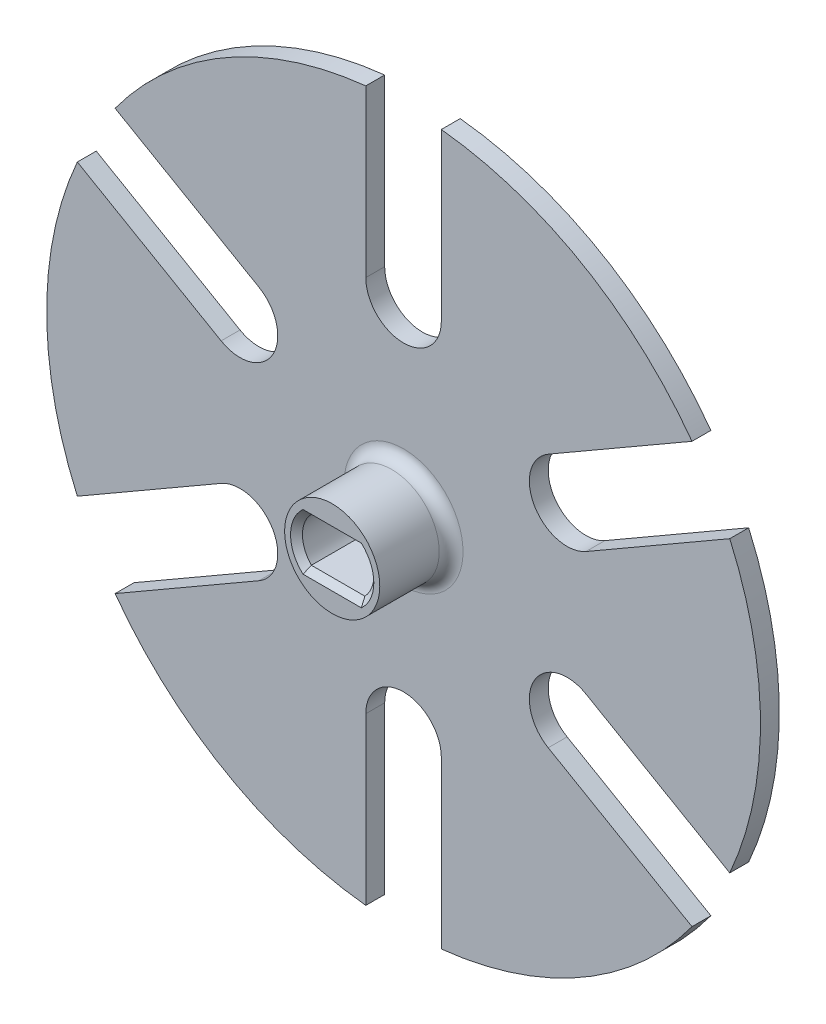
ISO-10303-21;
HEADER;
FILE_DESCRIPTION(('STEP AP214'),'2;1');
FILE_NAME('part.step','',(''),(''),'','','');
FILE_SCHEMA(('AUTOMOTIVE_DESIGN { 1 0 10303 214 1 1 1 1 }'));
ENDSEC;
DATA;
#1=APPLICATION_CONTEXT('core data for automotive mechanical design processes');
#2=APPLICATION_PROTOCOL_DEFINITION('international standard','automotive_design',2000,#1);
#3=PRODUCT_CONTEXT('',#1,'mechanical');
#4=PRODUCT('Part','Part','',(#3));
#5=PRODUCT_RELATED_PRODUCT_CATEGORY('part','',(#4));
#6=PRODUCT_DEFINITION_FORMATION('','',#4);
#7=PRODUCT_DEFINITION_CONTEXT('part definition',#1,'design');
#8=PRODUCT_DEFINITION('design','',#6,#7);
#9=PRODUCT_DEFINITION_SHAPE('','',#8);
#10=(LENGTH_UNIT() NAMED_UNIT(*) SI_UNIT(.MILLI.,.METRE.));
#11=(NAMED_UNIT(*) PLANE_ANGLE_UNIT() SI_UNIT($,.RADIAN.));
#12=(NAMED_UNIT(*) SI_UNIT($,.STERADIAN.) SOLID_ANGLE_UNIT());
#13=UNCERTAINTY_MEASURE_WITH_UNIT(LENGTH_MEASURE(1.E-05),#10,'distance_accuracy_value','');
#14=(GEOMETRIC_REPRESENTATION_CONTEXT(3) GLOBAL_UNCERTAINTY_ASSIGNED_CONTEXT((#13)) GLOBAL_UNIT_ASSIGNED_CONTEXT((#10,
#11,#12)) REPRESENTATION_CONTEXT('',''));
#15=CARTESIAN_POINT('',(0.,0.,0.));
#16=DIRECTION('',(0.,0.,1.));
#17=DIRECTION('',(1.,0.,0.));
#18=AXIS2_PLACEMENT_3D('',#15,#16,#17);
#19=CARTESIAN_POINT('',(0.,0.,-1.5875));
#20=DIRECTION('',(0.,0.,1.));
#21=DIRECTION('',(1.,0.,0.));
#22=AXIS2_PLACEMENT_3D('',#19,#20,#21);
#23=CYLINDRICAL_SURFACE('',#22,30.);
#24=CARTESIAN_POINT('',(0.,0.,-1.5875));
#25=DIRECTION('',(0.,0.,-1.));
#26=DIRECTION('',(-1.,0.,0.));
#27=AXIS2_PLACEMENT_3D('',#24,#25,#26);
#28=CIRCLE('',#27,30.);
#29=CARTESIAN_POINT('',(-24.2473510978869,17.6653888928549,-1.5875));
#30=VERTEX_POINT('',#29);
#31=CARTESIAN_POINT('',(-3.17500000000001,29.8315164716781,-1.5875));
#32=VERTEX_POINT('',#31);
#33=EDGE_CURVE('E464',#30,#32,#28,.T.);
#34=ORIENTED_EDGE('',*,*,#33,.F.);
#35=DIRECTION('',(0.,0.,1.));
#36=VECTOR('',#35,1.);
#37=CARTESIAN_POINT('',(-24.2473510978869,17.6653888928549,-1.5875));
#38=LINE('',#37,#36);
#39=CARTESIAN_POINT('',(-24.2473510978869,17.6653888928549,0.));
#40=VERTEX_POINT('',#39);
#41=EDGE_CURVE('E420',#30,#40,#38,.T.);
#42=ORIENTED_EDGE('',*,*,#41,.T.);
#43=CARTESIAN_POINT('',(0.,0.,0.));
#44=DIRECTION('',(0.,0.,-1.));
#45=DIRECTION('',(-1.,0.,0.));
#46=AXIS2_PLACEMENT_3D('',#43,#44,#45);
#47=CIRCLE('',#46,30.);
#48=CARTESIAN_POINT('',(-3.17500000000001,29.8315164716781,0.));
#49=VERTEX_POINT('',#48);
#50=EDGE_CURVE('E470',#40,#49,#47,.T.);
#51=ORIENTED_EDGE('',*,*,#50,.T.);
#52=DIRECTION('',(0.,0.,1.));
#53=VECTOR('',#52,1.);
#54=CARTESIAN_POINT('',(-3.17500000000001,29.8315164716781,-1.5875));
#55=LINE('',#54,#53);
#56=EDGE_CURVE('E447',#49,#32,#55,.F.);
#57=ORIENTED_EDGE('',*,*,#56,.T.);
#58=EDGE_LOOP('',(#34,#42,#51,#57));
#59=FACE_BOUND('',#58,.T.);
#60=ADVANCED_FACE('F47',(#59),#23,.T.);
#61=CARTESIAN_POINT('',(-27.4223510978872,-12.1661275788232,0.));
#62=VERTEX_POINT('',#61);
#63=CARTESIAN_POINT('',(-27.422351097887,12.1661275788238,0.));
#64=VERTEX_POINT('',#63);
#65=EDGE_CURVE('E610',#62,#64,#47,.T.);
#66=ORIENTED_EDGE('',*,*,#65,.T.);
#67=DIRECTION('',(0.,0.,1.));
#68=VECTOR('',#67,1.);
#69=CARTESIAN_POINT('',(-27.422351097887,12.1661275788238,-1.5875));
#70=LINE('',#69,#68);
#71=CARTESIAN_POINT('',(-27.422351097887,12.1661275788238,-1.5875));
#72=VERTEX_POINT('',#71);
#73=EDGE_CURVE('E65',#64,#72,#70,.F.);
#74=ORIENTED_EDGE('',*,*,#73,.T.);
#75=CARTESIAN_POINT('',(-27.4223510978872,-12.1661275788232,-1.5875));
#76=VERTEX_POINT('',#75);
#77=EDGE_CURVE('E634',#76,#72,#28,.T.);
#78=ORIENTED_EDGE('',*,*,#77,.F.);
#79=DIRECTION('',(0.,0.,1.));
#80=VECTOR('',#79,1.);
#81=CARTESIAN_POINT('',(-27.4223510978872,-12.1661275788232,-1.5875));
#82=LINE('',#81,#80);
#83=EDGE_CURVE('E414',#76,#62,#82,.T.);
#84=ORIENTED_EDGE('',*,*,#83,.T.);
#85=EDGE_LOOP('',(#66,#74,#78,#84));
#86=FACE_BOUND('',#85,.T.);
#87=ADVANCED_FACE('F669',(#86),#23,.T.);
#88=CARTESIAN_POINT('',(-3.17499999999999,-29.8315164716781,0.));
#89=VERTEX_POINT('',#88);
#90=CARTESIAN_POINT('',(-24.2473510978873,-17.6653888928544,0.));
#91=VERTEX_POINT('',#90);
#92=EDGE_CURVE('E602',#89,#91,#47,.T.);
#93=ORIENTED_EDGE('',*,*,#92,.T.);
#94=DIRECTION('',(0.,0.,1.));
#95=VECTOR('',#94,1.);
#96=CARTESIAN_POINT('',(-24.2473510978873,-17.6653888928544,-1.5875));
#97=LINE('',#96,#95);
#98=CARTESIAN_POINT('',(-24.2473510978873,-17.6653888928544,-1.5875));
#99=VERTEX_POINT('',#98);
#100=EDGE_CURVE('E72',#91,#99,#97,.F.);
#101=ORIENTED_EDGE('',*,*,#100,.T.);
#102=CARTESIAN_POINT('',(-3.17499999999999,-29.8315164716781,-1.5875));
#103=VERTEX_POINT('',#102);
#104=EDGE_CURVE('E637',#103,#99,#28,.T.);
#105=ORIENTED_EDGE('',*,*,#104,.F.);
#106=DIRECTION('',(0.,0.,1.));
#107=VECTOR('',#106,1.);
#108=CARTESIAN_POINT('',(-3.17499999999999,-29.8315164716781,-1.5875));
#109=LINE('',#108,#107);
#110=EDGE_CURVE('E408',#103,#89,#109,.T.);
#111=ORIENTED_EDGE('',*,*,#110,.T.);
#112=EDGE_LOOP('',(#93,#101,#105,#111));
#113=FACE_BOUND('',#112,.T.);
#114=ADVANCED_FACE('F605',(#113),#23,.T.);
#115=CARTESIAN_POINT('',(24.247351097887,-17.6653888928547,0.));
#116=VERTEX_POINT('',#115);
#117=CARTESIAN_POINT('',(3.17500000000001,-29.8315164716781,0.));
#118=VERTEX_POINT('',#117);
#119=EDGE_CURVE('E609',#116,#118,#47,.T.);
#120=ORIENTED_EDGE('',*,*,#119,.T.);
#121=DIRECTION('',(0.,0.,1.));
#122=VECTOR('',#121,1.);
#123=CARTESIAN_POINT('',(3.17500000000001,-29.8315164716781,-1.5875));
#124=LINE('',#123,#122);
#125=CARTESIAN_POINT('',(3.17500000000001,-29.8315164716781,-1.5875));
#126=VERTEX_POINT('',#125);
#127=EDGE_CURVE('E404',#118,#126,#124,.F.);
#128=ORIENTED_EDGE('',*,*,#127,.T.);
#129=CARTESIAN_POINT('',(24.247351097887,-17.6653888928547,-1.5875));
#130=VERTEX_POINT('',#129);
#131=EDGE_CURVE('E640',#130,#126,#28,.T.);
#132=ORIENTED_EDGE('',*,*,#131,.F.);
#133=DIRECTION('',(0.,0.,1.));
#134=VECTOR('',#133,1.);
#135=CARTESIAN_POINT('',(24.2473510978871,-17.6653888928547,-1.5875));
#136=LINE('',#135,#134);
#137=EDGE_CURVE('E400',#130,#116,#136,.T.);
#138=ORIENTED_EDGE('',*,*,#137,.T.);
#139=EDGE_LOOP('',(#120,#128,#132,#138));
#140=FACE_BOUND('',#139,.T.);
#141=ADVANCED_FACE('F646',(#140),#23,.T.);
#142=CARTESIAN_POINT('',(27.4223510978872,12.1661275788234,0.));
#143=VERTEX_POINT('',#142);
#144=CARTESIAN_POINT('',(27.4223510978871,-12.1661275788236,0.));
#145=VERTEX_POINT('',#144);
#146=EDGE_CURVE('E469',#143,#145,#47,.T.);
#147=ORIENTED_EDGE('',*,*,#146,.T.);
#148=DIRECTION('',(0.,0.,1.));
#149=VECTOR('',#148,1.);
#150=CARTESIAN_POINT('',(27.4223510978871,-12.1661275788236,-1.5875));
#151=LINE('',#150,#149);
#152=CARTESIAN_POINT('',(27.4223510978871,-12.1661275788236,-1.5875));
#153=VERTEX_POINT('',#152);
#154=EDGE_CURVE('E397',#145,#153,#151,.F.);
#155=ORIENTED_EDGE('',*,*,#154,.T.);
#156=CARTESIAN_POINT('',(27.4223510978872,12.1661275788234,-1.5875));
#157=VERTEX_POINT('',#156);
#158=EDGE_CURVE('E273',#157,#153,#28,.T.);
#159=ORIENTED_EDGE('',*,*,#158,.F.);
#160=DIRECTION('',(0.,0.,1.));
#161=VECTOR('',#160,1.);
#162=CARTESIAN_POINT('',(27.4223510978872,12.1661275788234,-1.5875));
#163=LINE('',#162,#161);
#164=EDGE_CURVE('E393',#157,#143,#163,.T.);
#165=ORIENTED_EDGE('',*,*,#164,.T.);
#166=EDGE_LOOP('',(#147,#155,#159,#165));
#167=FACE_BOUND('',#166,.T.);
#168=ADVANCED_FACE('F681',(#167),#23,.T.);
#169=CARTESIAN_POINT('',(0.,0.,6.));
#170=DIRECTION('',(0.,0.,1.));
#171=DIRECTION('',(1.,0.,0.));
#172=AXIS2_PLACEMENT_3D('',#169,#170,#171);
#173=PLANE('',#172);
#174=DIRECTION('',(1.,0.,0.));
#175=VECTOR('',#174,1.);
#176=CARTESIAN_POINT('',(0.,2.35499999999999,6.));
#177=LINE('',#176,#175);
#178=CARTESIAN_POINT('',(-2.4515119546,2.35499999999999,6.));
#179=VERTEX_POINT('',#178);
#180=CARTESIAN_POINT('',(2.4515119546,2.35499999999999,6.));
#181=VERTEX_POINT('',#180);
#182=EDGE_CURVE('E514',#179,#181,#177,.T.);
#183=ORIENTED_EDGE('',*,*,#182,.T.);
#184=CARTESIAN_POINT('',(0.330983333333334,0.,6.));
#185=DIRECTION('',(0.,0.,1.));
#186=DIRECTION('',(1.,0.,0.));
#187=AXIS2_PLACEMENT_3D('',#184,#185,#186);
#188=CIRCLE('',#187,3.16901666666666);
#189=CARTESIAN_POINT('',(2.4515119546,-2.35499999999999,6.));
#190=VERTEX_POINT('',#189);
#191=EDGE_CURVE('E523',#181,#190,#188,.F.);
#192=ORIENTED_EDGE('',*,*,#191,.T.);
#193=DIRECTION('',(-1.,0.,0.));
#194=VECTOR('',#193,1.);
#195=CARTESIAN_POINT('',(0.,-2.35499999999999,6.));
#196=LINE('',#195,#194);
#197=CARTESIAN_POINT('',(-2.4515119546,-2.35499999999999,6.));
#198=VERTEX_POINT('',#197);
#199=EDGE_CURVE('E520',#190,#198,#196,.T.);
#200=ORIENTED_EDGE('',*,*,#199,.T.);
#201=CARTESIAN_POINT('',(-0.330983333333334,0.,6.));
#202=DIRECTION('',(0.,0.,1.));
#203=DIRECTION('',(1.,0.,0.));
#204=AXIS2_PLACEMENT_3D('',#201,#202,#203);
#205=CIRCLE('',#204,3.16901666666666);
#206=EDGE_CURVE('E517',#198,#179,#205,.F.);
#207=ORIENTED_EDGE('',*,*,#206,.T.);
#208=EDGE_LOOP('',(#183,#192,#200,#207));
#209=FACE_BOUND('',#208,.T.);
#210=CARTESIAN_POINT('',(0.,0.,6.));
#211=DIRECTION('',(0.,0.,1.));
#212=DIRECTION('',(1.,0.,0.));
#213=AXIS2_PLACEMENT_3D('',#210,#211,#212);
#214=CIRCLE('',#213,4.);
#215=CARTESIAN_POINT('',(4.,0.,6.));
#216=VERTEX_POINT('',#215);
#217=EDGE_CURVE('E498',#216,#216,#214,.T.);
#218=ORIENTED_EDGE('',*,*,#217,.T.);
#219=EDGE_LOOP('',(#218));
#220=FACE_BOUND('',#219,.T.);
#221=ADVANCED_FACE('F690',(#209,#220),#173,.T.);
#222=CARTESIAN_POINT('',(0.,0.,6.));
#223=DIRECTION('',(0.,0.,-1.));
#224=DIRECTION('',(-1.,0.,0.));
#225=AXIS2_PLACEMENT_3D('',#222,#223,#224);
#226=CYLINDRICAL_SURFACE('',#225,4.);
#227=CARTESIAN_POINT('',(0.,0.,1.));
#228=DIRECTION('',(0.,0.,-1.));
#229=DIRECTION('',(-1.,0.,0.));
#230=AXIS2_PLACEMENT_3D('',#227,#228,#229);
#231=CIRCLE('',#230,4.);
#232=CARTESIAN_POINT('',(-4.,0.,1.));
#233=VERTEX_POINT('',#232);
#234=EDGE_CURVE('E502',#233,#233,#231,.F.);
#235=ORIENTED_EDGE('',*,*,#234,.T.);
#236=EDGE_LOOP('',(#235));
#237=FACE_BOUND('',#236,.T.);
#238=ORIENTED_EDGE('',*,*,#217,.F.);
#239=EDGE_LOOP('',(#238));
#240=FACE_BOUND('',#239,.T.);
#241=ADVANCED_FACE('F696',(#237,#240),#226,.T.);
#242=CARTESIAN_POINT('',(-0.330983333333334,0.,6.));
#243=DIRECTION('',(0.,0.,-1.));
#244=DIRECTION('',(-1.,0.,0.));
#245=AXIS2_PLACEMENT_3D('',#242,#243,#244);
#246=CYLINDRICAL_SURFACE('',#245,2.66901666666667);
#247=DIRECTION('',(0.,0.,-1.));
#248=VECTOR('',#247,1.);
#249=CARTESIAN_POINT('',(-2.25,1.855,6.));
#250=LINE('',#249,#248);
#251=CARTESIAN_POINT('',(-2.25,1.855,5.50000000000001));
#252=VERTEX_POINT('',#251);
#253=CARTESIAN_POINT('',(-2.25,1.855,0.));
#254=VERTEX_POINT('',#253);
#255=EDGE_CURVE('E486',#252,#254,#250,.T.);
#256=ORIENTED_EDGE('',*,*,#255,.F.);
#257=CARTESIAN_POINT('',(-0.330983333333334,0.,5.50000000000001));
#258=DIRECTION('',(0.,0.,1.));
#259=DIRECTION('',(1.,0.,0.));
#260=AXIS2_PLACEMENT_3D('',#257,#258,#259);
#261=CIRCLE('',#260,2.66901666666667);
#262=CARTESIAN_POINT('',(-2.25,-1.855,5.50000000000001));
#263=VERTEX_POINT('',#262);
#264=EDGE_CURVE('E530',#252,#263,#261,.T.);
#265=ORIENTED_EDGE('',*,*,#264,.T.);
#266=DIRECTION('',(0.,0.,-1.));
#267=VECTOR('',#266,1.);
#268=CARTESIAN_POINT('',(-2.25,-1.855,6.));
#269=LINE('',#268,#267);
#270=CARTESIAN_POINT('',(-2.25,-1.855,0.));
#271=VERTEX_POINT('',#270);
#272=EDGE_CURVE('E495',#263,#271,#269,.T.);
#273=ORIENTED_EDGE('',*,*,#272,.T.);
#274=CARTESIAN_POINT('',(-0.330983333333334,0.,0.));
#275=DIRECTION('',(0.,0.,1.));
#276=DIRECTION('',(1.,0.,0.));
#277=AXIS2_PLACEMENT_3D('',#274,#275,#276);
#278=CIRCLE('',#277,2.66901666666667);
#279=EDGE_CURVE('E463',#254,#271,#278,.T.);
#280=ORIENTED_EDGE('',*,*,#279,.F.);
#281=EDGE_LOOP('',(#256,#265,#273,#280));
#282=FACE_BOUND('',#281,.T.);
#283=ADVANCED_FACE('F745',(#282),#246,.F.);
#284=CARTESIAN_POINT('',(-2.25,-1.855,6.));
#285=DIRECTION('',(0.,1.,0.));
#286=DIRECTION('',(-1.,0.,0.));
#287=AXIS2_PLACEMENT_3D('',#284,#285,#286);
#288=PLANE('',#287);
#289=ORIENTED_EDGE('',*,*,#272,.F.);
#290=DIRECTION('',(1.,0.,0.));
#291=VECTOR('',#290,1.);
#292=CARTESIAN_POINT('',(-2.25,-1.855,5.50000000000001));
#293=LINE('',#292,#291);
#294=CARTESIAN_POINT('',(2.25,-1.855,5.50000000000001));
#295=VERTEX_POINT('',#294);
#296=EDGE_CURVE('E527',#263,#295,#293,.T.);
#297=ORIENTED_EDGE('',*,*,#296,.T.);
#298=DIRECTION('',(0.,0.,-1.));
#299=VECTOR('',#298,1.);
#300=CARTESIAN_POINT('',(2.25,-1.855,6.));
#301=LINE('',#300,#299);
#302=CARTESIAN_POINT('',(2.25,-1.855,0.));
#303=VERTEX_POINT('',#302);
#304=EDGE_CURVE('E492',#295,#303,#301,.T.);
#305=ORIENTED_EDGE('',*,*,#304,.T.);
#306=DIRECTION('',(1.,0.,0.));
#307=VECTOR('',#306,1.);
#308=CARTESIAN_POINT('',(-2.25,-1.855,0.));
#309=LINE('',#308,#307);
#310=EDGE_CURVE('E474',#271,#303,#309,.T.);
#311=ORIENTED_EDGE('',*,*,#310,.F.);
#312=EDGE_LOOP('',(#289,#297,#305,#311));
#313=FACE_BOUND('',#312,.T.);
#314=ADVANCED_FACE('F752',(#313),#288,.T.);
#315=CARTESIAN_POINT('',(0.330983333333334,0.,6.));
#316=DIRECTION('',(0.,0.,-1.));
#317=DIRECTION('',(-1.,0.,0.));
#318=AXIS2_PLACEMENT_3D('',#315,#316,#317);
#319=CYLINDRICAL_SURFACE('',#318,2.66901666666667);
#320=ORIENTED_EDGE('',*,*,#304,.F.);
#321=CARTESIAN_POINT('',(0.330983333333334,0.,5.50000000000001));
#322=DIRECTION('',(0.,0.,1.));
#323=DIRECTION('',(1.,0.,0.));
#324=AXIS2_PLACEMENT_3D('',#321,#322,#323);
#325=CIRCLE('',#324,2.66901666666667);
#326=CARTESIAN_POINT('',(2.25,1.855,5.50000000000001));
#327=VERTEX_POINT('',#326);
#328=EDGE_CURVE('E510',#295,#327,#325,.T.);
#329=ORIENTED_EDGE('',*,*,#328,.T.);
#330=DIRECTION('',(0.,0.,-1.));
#331=VECTOR('',#330,1.);
#332=CARTESIAN_POINT('',(2.25,1.855,6.));
#333=LINE('',#332,#331);
#334=CARTESIAN_POINT('',(2.25,1.855,0.));
#335=VERTEX_POINT('',#334);
#336=EDGE_CURVE('E489',#327,#335,#333,.T.);
#337=ORIENTED_EDGE('',*,*,#336,.T.);
#338=CARTESIAN_POINT('',(0.330983333333334,0.,0.));
#339=DIRECTION('',(0.,0.,1.));
#340=DIRECTION('',(-1.,0.,0.));
#341=AXIS2_PLACEMENT_3D('',#338,#339,#340);
#342=CIRCLE('',#341,2.66901666666667);
#343=EDGE_CURVE('E478',#303,#335,#342,.T.);
#344=ORIENTED_EDGE('',*,*,#343,.F.);
#345=EDGE_LOOP('',(#320,#329,#337,#344));
#346=FACE_BOUND('',#345,.T.);
#347=ADVANCED_FACE('F758',(#346),#319,.F.);
#348=CARTESIAN_POINT('',(-2.25,1.855,6.));
#349=DIRECTION('',(0.,-1.,0.));
#350=DIRECTION('',(1.,0.,0.));
#351=AXIS2_PLACEMENT_3D('',#348,#349,#350);
#352=PLANE('',#351);
#353=ORIENTED_EDGE('',*,*,#336,.F.);
#354=DIRECTION('',(-1.,0.,0.));
#355=VECTOR('',#354,1.);
#356=CARTESIAN_POINT('',(-2.25,1.855,5.50000000000001));
#357=LINE('',#356,#355);
#358=EDGE_CURVE('E533',#327,#252,#357,.T.);
#359=ORIENTED_EDGE('',*,*,#358,.T.);
#360=ORIENTED_EDGE('',*,*,#255,.T.);
#361=DIRECTION('',(-1.,0.,0.));
#362=VECTOR('',#361,1.);
#363=CARTESIAN_POINT('',(-2.25,1.855,0.));
#364=LINE('',#363,#362);
#365=EDGE_CURVE('E482',#335,#254,#364,.T.);
#366=ORIENTED_EDGE('',*,*,#365,.F.);
#367=EDGE_LOOP('',(#353,#359,#360,#366));
#368=FACE_BOUND('',#367,.T.);
#369=ADVANCED_FACE('F688',(#368),#352,.T.);
#370=CARTESIAN_POINT('',(0.,0.,0.));
#371=DIRECTION('',(0.,0.,-1.));
#372=DIRECTION('',(-1.,0.,0.));
#373=AXIS2_PLACEMENT_3D('',#370,#371,#372);
#374=PLANE('',#373);
#375=ORIENTED_EDGE('',*,*,#365,.T.);
#376=ORIENTED_EDGE('',*,*,#279,.T.);
#377=ORIENTED_EDGE('',*,*,#310,.T.);
#378=ORIENTED_EDGE('',*,*,#343,.T.);
#379=EDGE_LOOP('',(#375,#376,#377,#378));
#380=FACE_BOUND('',#379,.T.);
#381=ADVANCED_FACE('F679',(#380),#374,.F.);
#382=CARTESIAN_POINT('',(3.17499999999999,29.8315164716781,0.));
#383=VERTEX_POINT('',#382);
#384=CARTESIAN_POINT('',(24.2473510978872,17.6653888928546,0.));
#385=VERTEX_POINT('',#384);
#386=EDGE_CURVE('E465',#383,#385,#47,.T.);
#387=ORIENTED_EDGE('',*,*,#386,.T.);
#388=DIRECTION('',(0.,0.,1.));
#389=VECTOR('',#388,1.);
#390=CARTESIAN_POINT('',(24.2473510978872,17.6653888928546,-1.5875));
#391=LINE('',#390,#389);
#392=CARTESIAN_POINT('',(24.2473510978872,17.6653888928546,-1.5875));
#393=VERTEX_POINT('',#392);
#394=EDGE_CURVE('E386',#385,#393,#391,.F.);
#395=ORIENTED_EDGE('',*,*,#394,.T.);
#396=CARTESIAN_POINT('',(3.17499999999999,29.8315164716781,-1.5875));
#397=VERTEX_POINT('',#396);
#398=EDGE_CURVE('E459',#397,#393,#28,.T.);
#399=ORIENTED_EDGE('',*,*,#398,.F.);
#400=DIRECTION('',(0.,0.,1.));
#401=VECTOR('',#400,1.);
#402=CARTESIAN_POINT('',(3.17499999999999,29.8315164716781,-1.5875));
#403=LINE('',#402,#401);
#404=EDGE_CURVE('E454',#397,#383,#403,.T.);
#405=ORIENTED_EDGE('',*,*,#404,.T.);
#406=EDGE_LOOP('',(#387,#395,#399,#405));
#407=FACE_BOUND('',#406,.T.);
#408=ADVANCED_FACE('F671',(#407),#23,.T.);
#409=CARTESIAN_POINT('',(0.,0.,-1.5875));
#410=DIRECTION('',(0.,0.,-1.));
#411=DIRECTION('',(-1.,0.,0.));
#412=AXIS2_PLACEMENT_3D('',#409,#410,#411);
#413=PLANE('',#412);
#414=DIRECTION('',(-0.866025403784433,0.50000000000001,0.));
#415=VECTOR('',#414,1.);
#416=CARTESIAN_POINT('',(-56.154743797327,36.0871306570162,-1.5875));
#417=LINE('',#416,#415);
#418=CARTESIAN_POINT('',(-12.1606532850778,10.6871306570157,-1.5875));
#419=VERTEX_POINT('',#418);
#420=EDGE_CURVE('E350',#419,#30,#417,.T.);
#421=ORIENTED_EDGE('',*,*,#420,.T.);
#422=ORIENTED_EDGE('',*,*,#33,.T.);
#423=DIRECTION('',(0.,-1.,0.));
#424=VECTOR('',#423,1.);
#425=CARTESIAN_POINT('',(-3.17500000000001,66.675,-1.5875));
#426=LINE('',#425,#424);
#427=CARTESIAN_POINT('',(-3.175,15.875,-1.5875));
#428=VERTEX_POINT('',#427);
#429=EDGE_CURVE('E425',#32,#428,#426,.T.);
#430=ORIENTED_EDGE('',*,*,#429,.T.);
#431=CARTESIAN_POINT('',(0.,15.875,-1.5875));
#432=DIRECTION('',(0.,0.,1.));
#433=DIRECTION('',(1.,0.,0.));
#434=AXIS2_PLACEMENT_3D('',#431,#432,#433);
#435=CIRCLE('',#434,3.175);
#436=CARTESIAN_POINT('',(3.17499999999999,15.875,-1.5875));
#437=VERTEX_POINT('',#436);
#438=EDGE_CURVE('E429',#428,#437,#435,.T.);
#439=ORIENTED_EDGE('',*,*,#438,.T.);
#440=DIRECTION('',(0.,1.,0.));
#441=VECTOR('',#440,1.);
#442=CARTESIAN_POINT('',(3.17499999999999,66.675,-1.5875));
#443=LINE('',#442,#441);
#444=EDGE_CURVE('E434',#437,#397,#443,.T.);
#445=ORIENTED_EDGE('',*,*,#444,.T.);
#446=ORIENTED_EDGE('',*,*,#398,.T.);
#447=DIRECTION('',(-0.86602540378444,-0.499999999999998,0.));
#448=VECTOR('',#447,1.);
#449=CARTESIAN_POINT('',(56.1547437973275,36.0871306570155,-1.5875));
#450=LINE('',#449,#448);
#451=CARTESIAN_POINT('',(12.160653285078,10.6871306570156,-1.5875));
#452=VERTEX_POINT('',#451);
#453=EDGE_CURVE('E365',#393,#452,#450,.T.);
#454=ORIENTED_EDGE('',*,*,#453,.T.);
#455=CARTESIAN_POINT('',(13.748153285078,7.93749999999997,-1.5875));
#456=DIRECTION('',(0.,0.,1.));
#457=DIRECTION('',(0.499999999999998,-0.86602540378444,0.));
#458=AXIS2_PLACEMENT_3D('',#455,#456,#457);
#459=CIRCLE('',#458,3.175);
#460=CARTESIAN_POINT('',(15.335653285078,5.18786934298437,-1.5875));
#461=VERTEX_POINT('',#460);
#462=EDGE_CURVE('E369',#452,#461,#459,.T.);
#463=ORIENTED_EDGE('',*,*,#462,.T.);
#464=DIRECTION('',(0.86602540378444,0.499999999999998,0.));
#465=VECTOR('',#464,1.);
#466=CARTESIAN_POINT('',(59.3297437973275,30.5878693429843,-1.5875));
#467=LINE('',#466,#465);
#468=EDGE_CURVE('E374',#461,#157,#467,.T.);
#469=ORIENTED_EDGE('',*,*,#468,.T.);
#470=ORIENTED_EDGE('',*,*,#158,.T.);
#471=DIRECTION('',(-0.866025403784436,0.500000000000004,0.));
#472=VECTOR('',#471,1.);
#473=CARTESIAN_POINT('',(59.3297437973273,-30.5878693429847,-1.5875));
#474=LINE('',#473,#472);
#475=CARTESIAN_POINT('',(15.3356532850779,-5.18786934298448,-1.5875));
#476=VERTEX_POINT('',#475);
#477=EDGE_CURVE('E249',#153,#476,#474,.T.);
#478=ORIENTED_EDGE('',*,*,#477,.T.);
#479=CARTESIAN_POINT('',(13.7481532850779,-7.93750000000006,-1.5875));
#480=DIRECTION('',(0.,0.,1.));
#481=DIRECTION('',(-0.500000000000004,-0.866025403784436,0.));
#482=AXIS2_PLACEMENT_3D('',#479,#480,#481);
#483=CIRCLE('',#482,3.175);
#484=CARTESIAN_POINT('',(12.1606532850779,-10.6871306570156,-1.5875));
#485=VERTEX_POINT('',#484);
#486=EDGE_CURVE('E261',#476,#485,#483,.T.);
#487=ORIENTED_EDGE('',*,*,#486,.T.);
#488=DIRECTION('',(0.866025403784437,-0.500000000000004,0.));
#489=VECTOR('',#488,1.);
#490=CARTESIAN_POINT('',(56.1547437973273,-36.0871306570158,-1.5875));
#491=LINE('',#490,#489);
#492=EDGE_CURVE('E258',#485,#130,#491,.T.);
#493=ORIENTED_EDGE('',*,*,#492,.T.);
#494=ORIENTED_EDGE('',*,*,#131,.T.);
#495=DIRECTION('',(0.,1.,0.));
#496=VECTOR('',#495,1.);
#497=CARTESIAN_POINT('',(3.17500000000001,-66.675,-1.5875));
#498=LINE('',#497,#496);
#499=CARTESIAN_POINT('',(3.175,-15.875,-1.5875));
#500=VERTEX_POINT('',#499);
#501=EDGE_CURVE('E289',#126,#500,#498,.T.);
#502=ORIENTED_EDGE('',*,*,#501,.T.);
#503=CARTESIAN_POINT('',(0.,-15.875,-1.5875));
#504=DIRECTION('',(0.,0.,1.));
#505=DIRECTION('',(-1.,0.,0.));
#506=AXIS2_PLACEMENT_3D('',#503,#504,#505);
#507=CIRCLE('',#506,3.175);
#508=CARTESIAN_POINT('',(-3.17499999999999,-15.875,-1.5875));
#509=VERTEX_POINT('',#508);
#510=EDGE_CURVE('E293',#500,#509,#507,.T.);
#511=ORIENTED_EDGE('',*,*,#510,.T.);
#512=DIRECTION('',(0.,-1.,0.));
#513=VECTOR('',#512,1.);
#514=CARTESIAN_POINT('',(-3.17499999999999,-66.675,-1.5875));
#515=LINE('',#514,#513);
#516=EDGE_CURVE('E298',#509,#103,#515,.T.);
#517=ORIENTED_EDGE('',*,*,#516,.T.);
#518=ORIENTED_EDGE('',*,*,#104,.T.);
#519=DIRECTION('',(0.866025403784443,0.499999999999992,0.));
#520=VECTOR('',#519,1.);
#521=CARTESIAN_POINT('',(-56.1547437973278,-36.0871306570151,-1.5875));
#522=LINE('',#521,#520);
#523=CARTESIAN_POINT('',(-12.1606532850781,-10.6871306570155,-1.5875));
#524=VERTEX_POINT('',#523);
#525=EDGE_CURVE('E315',#99,#524,#522,.T.);
#526=ORIENTED_EDGE('',*,*,#525,.T.);
#527=CARTESIAN_POINT('',(-13.748153285078,-7.93749999999987,-1.5875));
#528=DIRECTION('',(0.,0.,1.));
#529=DIRECTION('',(-0.499999999999992,0.866025403784443,0.));
#530=AXIS2_PLACEMENT_3D('',#527,#528,#529);
#531=CIRCLE('',#530,3.175);
#532=CARTESIAN_POINT('',(-15.335653285078,-5.18786934298427,-1.5875));
#533=VERTEX_POINT('',#532);
#534=EDGE_CURVE('E319',#524,#533,#531,.T.);
#535=ORIENTED_EDGE('',*,*,#534,.T.);
#536=DIRECTION('',(-0.866025403784443,-0.499999999999992,0.));
#537=VECTOR('',#536,1.);
#538=CARTESIAN_POINT('',(-59.3297437973277,-30.5878693429839,-1.5875));
#539=LINE('',#538,#537);
#540=EDGE_CURVE('E324',#533,#76,#539,.T.);
#541=ORIENTED_EDGE('',*,*,#540,.T.);
#542=ORIENTED_EDGE('',*,*,#77,.T.);
#543=DIRECTION('',(0.866025403784433,-0.50000000000001,0.));
#544=VECTOR('',#543,1.);
#545=CARTESIAN_POINT('',(-59.3297437973271,30.5878693429851,-1.5875));
#546=LINE('',#545,#544);
#547=CARTESIAN_POINT('',(-15.3356532850779,5.18786934298458,-1.5875));
#548=VERTEX_POINT('',#547);
#549=EDGE_CURVE('E341',#72,#548,#546,.T.);
#550=ORIENTED_EDGE('',*,*,#549,.T.);
#551=CARTESIAN_POINT('',(-13.7481532850779,7.93750000000016,-1.5875));
#552=DIRECTION('',(0.,0.,1.));
#553=DIRECTION('',(0.50000000000001,0.866025403784433,0.));
#554=AXIS2_PLACEMENT_3D('',#551,#552,#553);
#555=CIRCLE('',#554,3.175);
#556=EDGE_CURVE('E345',#548,#419,#555,.T.);
#557=ORIENTED_EDGE('',*,*,#556,.T.);
#558=EDGE_LOOP('',(#421,#422,#430,#439,#445,#446,#454,#463,#469,#470,#478,#487,#493,#494,#502,
#511,#517,#518,#526,#535,#541,#542,#550,#557));
#559=FACE_BOUND('',#558,.T.);
#560=ADVANCED_FACE('F270',(#559),#413,.T.);
#561=CARTESIAN_POINT('',(0.,0.,0.));
#562=DIRECTION('',(0.,0.,-1.));
#563=DIRECTION('',(-1.,0.,0.));
#564=AXIS2_PLACEMENT_3D('',#561,#562,#563);
#565=CIRCLE('',#564,5.);
#566=CARTESIAN_POINT('',(-5.,0.,0.));
#567=VERTEX_POINT('',#566);
#568=EDGE_CURVE('E506',#567,#567,#565,.T.);
#569=ORIENTED_EDGE('',*,*,#568,.T.);
#570=EDGE_LOOP('',(#569));
#571=FACE_BOUND('',#570,.T.);
#572=ORIENTED_EDGE('',*,*,#50,.F.);
#573=DIRECTION('',(-0.866025403784433,0.50000000000001,0.));
#574=VECTOR('',#573,1.);
#575=CARTESIAN_POINT('',(-56.154743797327,36.0871306570162,0.));
#576=LINE('',#575,#574);
#577=CARTESIAN_POINT('',(-12.1606532850778,10.6871306570157,0.));
#578=VERTEX_POINT('',#577);
#579=EDGE_CURVE('E346',#578,#40,#576,.T.);
#580=ORIENTED_EDGE('',*,*,#579,.F.);
#581=CARTESIAN_POINT('',(-13.7481532850779,7.93750000000016,0.));
#582=DIRECTION('',(0.,0.,1.));
#583=DIRECTION('',(0.50000000000001,0.866025403784433,0.));
#584=AXIS2_PLACEMENT_3D('',#581,#582,#583);
#585=CIRCLE('',#584,3.175);
#586=CARTESIAN_POINT('',(-15.3356532850779,5.18786934298458,0.));
#587=VERTEX_POINT('',#586);
#588=EDGE_CURVE('E354',#587,#578,#585,.T.);
#589=ORIENTED_EDGE('',*,*,#588,.F.);
#590=DIRECTION('',(-0.866025403784433,0.50000000000001,0.));
#591=VECTOR('',#590,1.);
#592=CARTESIAN_POINT('',(-1.58750000000004,-2.74963065701558,0.));
#593=LINE('',#592,#591);
#594=EDGE_CURVE('E11',#587,#64,#593,.T.);
#595=ORIENTED_EDGE('',*,*,#594,.T.);
#596=ORIENTED_EDGE('',*,*,#65,.F.);
#597=DIRECTION('',(-0.866025403784443,-0.499999999999992,0.));
#598=VECTOR('',#597,1.);
#599=CARTESIAN_POINT('',(-59.3297437973277,-30.5878693429839,0.));
#600=LINE('',#599,#598);
#601=CARTESIAN_POINT('',(-15.335653285078,-5.18786934298427,0.));
#602=VERTEX_POINT('',#601);
#603=EDGE_CURVE('E320',#602,#62,#600,.T.);
#604=ORIENTED_EDGE('',*,*,#603,.F.);
#605=CARTESIAN_POINT('',(-13.748153285078,-7.93749999999987,0.));
#606=DIRECTION('',(0.,0.,1.));
#607=DIRECTION('',(-0.499999999999992,0.866025403784443,0.));
#608=AXIS2_PLACEMENT_3D('',#605,#606,#607);
#609=CIRCLE('',#608,3.175);
#610=CARTESIAN_POINT('',(-12.1606532850781,-10.6871306570155,0.));
#611=VERTEX_POINT('',#610);
#612=EDGE_CURVE('E329',#611,#602,#609,.T.);
#613=ORIENTED_EDGE('',*,*,#612,.F.);
#614=DIRECTION('',(-0.866025403784443,-0.499999999999992,0.));
#615=VECTOR('',#614,1.);
#616=CARTESIAN_POINT('',(1.58749999999998,-2.74963065701561,0.));
#617=LINE('',#616,#615);
#618=EDGE_CURVE('E58',#611,#91,#617,.T.);
#619=ORIENTED_EDGE('',*,*,#618,.T.);
#620=ORIENTED_EDGE('',*,*,#92,.F.);
#621=DIRECTION('',(0.,-1.,0.));
#622=VECTOR('',#621,1.);
#623=CARTESIAN_POINT('',(-3.17499999999999,-66.675,0.));
#624=LINE('',#623,#622);
#625=CARTESIAN_POINT('',(-3.17499999999999,-15.875,0.));
#626=VERTEX_POINT('',#625);
#627=EDGE_CURVE('E294',#626,#89,#624,.T.);
#628=ORIENTED_EDGE('',*,*,#627,.F.);
#629=CARTESIAN_POINT('',(0.,-15.875,0.));
#630=DIRECTION('',(0.,0.,1.));
#631=DIRECTION('',(-1.,0.,0.));
#632=AXIS2_PLACEMENT_3D('',#629,#630,#631);
#633=CIRCLE('',#632,3.175);
#634=CARTESIAN_POINT('',(3.175,-15.875,0.));
#635=VERTEX_POINT('',#634);
#636=EDGE_CURVE('E303',#635,#626,#633,.T.);
#637=ORIENTED_EDGE('',*,*,#636,.F.);
#638=DIRECTION('',(0.,-1.,0.));
#639=VECTOR('',#638,1.);
#640=CARTESIAN_POINT('',(3.17500000000001,0.,0.));
#641=LINE('',#640,#639);
#642=EDGE_CURVE('E591',#635,#118,#641,.T.);
#643=ORIENTED_EDGE('',*,*,#642,.T.);
#644=ORIENTED_EDGE('',*,*,#119,.F.);
#645=DIRECTION('',(0.866025403784437,-0.500000000000004,0.));
#646=VECTOR('',#645,1.);
#647=CARTESIAN_POINT('',(56.1547437973273,-36.0871306570158,0.));
#648=LINE('',#647,#646);
#649=CARTESIAN_POINT('',(12.1606532850779,-10.6871306570156,0.));
#650=VERTEX_POINT('',#649);
#651=EDGE_CURVE('E275',#650,#116,#648,.T.);
#652=ORIENTED_EDGE('',*,*,#651,.F.);
#653=CARTESIAN_POINT('',(13.7481532850779,-7.93750000000006,0.));
#654=DIRECTION('',(0.,0.,1.));
#655=DIRECTION('',(-0.500000000000004,-0.866025403784436,0.));
#656=AXIS2_PLACEMENT_3D('',#653,#654,#655);
#657=CIRCLE('',#656,3.175);
#658=CARTESIAN_POINT('',(15.3356532850779,-5.18786934298448,0.));
#659=VERTEX_POINT('',#658);
#660=EDGE_CURVE('E278',#659,#650,#657,.T.);
#661=ORIENTED_EDGE('',*,*,#660,.F.);
#662=DIRECTION('',(0.866025403784436,-0.500000000000004,0.));
#663=VECTOR('',#662,1.);
#664=CARTESIAN_POINT('',(1.58750000000001,2.74963065701559,0.));
#665=LINE('',#664,#663);
#666=EDGE_CURVE('E252',#659,#145,#665,.T.);
#667=ORIENTED_EDGE('',*,*,#666,.T.);
#668=ORIENTED_EDGE('',*,*,#146,.F.);
#669=DIRECTION('',(0.86602540378444,0.499999999999998,0.));
#670=VECTOR('',#669,1.);
#671=CARTESIAN_POINT('',(59.3297437973275,30.5878693429843,0.));
#672=LINE('',#671,#670);
#673=CARTESIAN_POINT('',(15.335653285078,5.18786934298437,0.));
#674=VERTEX_POINT('',#673);
#675=EDGE_CURVE('E370',#674,#143,#672,.T.);
#676=ORIENTED_EDGE('',*,*,#675,.F.);
#677=CARTESIAN_POINT('',(13.748153285078,7.93749999999997,0.));
#678=DIRECTION('',(0.,0.,1.));
#679=DIRECTION('',(0.499999999999998,-0.86602540378444,0.));
#680=AXIS2_PLACEMENT_3D('',#677,#678,#679);
#681=CIRCLE('',#680,3.175);
#682=CARTESIAN_POINT('',(12.160653285078,10.6871306570156,0.));
#683=VERTEX_POINT('',#682);
#684=EDGE_CURVE('E287',#683,#674,#681,.T.);
#685=ORIENTED_EDGE('',*,*,#684,.F.);
#686=DIRECTION('',(0.86602540378444,0.499999999999998,0.));
#687=VECTOR('',#686,1.);
#688=CARTESIAN_POINT('',(-1.5875,2.74963065701561,0.));
#689=LINE('',#688,#687);
#690=EDGE_CURVE('E585',#683,#385,#689,.T.);
#691=ORIENTED_EDGE('',*,*,#690,.T.);
#692=ORIENTED_EDGE('',*,*,#386,.F.);
#693=DIRECTION('',(0.,1.,0.));
#694=VECTOR('',#693,1.);
#695=CARTESIAN_POINT('',(3.17499999999999,66.675,0.));
#696=LINE('',#695,#694);
#697=CARTESIAN_POINT('',(3.17499999999999,15.875,0.));
#698=VERTEX_POINT('',#697);
#699=EDGE_CURVE('E430',#698,#383,#696,.T.);
#700=ORIENTED_EDGE('',*,*,#699,.F.);
#701=CARTESIAN_POINT('',(0.,15.875,0.));
#702=DIRECTION('',(0.,0.,1.));
#703=DIRECTION('',(1.,0.,0.));
#704=AXIS2_PLACEMENT_3D('',#701,#702,#703);
#705=CIRCLE('',#704,3.175);
#706=CARTESIAN_POINT('',(-3.175,15.875,0.));
#707=VERTEX_POINT('',#706);
#708=EDGE_CURVE('E424',#707,#698,#705,.T.);
#709=ORIENTED_EDGE('',*,*,#708,.F.);
#710=DIRECTION('',(0.,1.,0.));
#711=VECTOR('',#710,1.);
#712=CARTESIAN_POINT('',(-3.17500000000001,0.,0.));
#713=LINE('',#712,#711);
#714=EDGE_CURVE('E536',#707,#49,#713,.T.);
#715=ORIENTED_EDGE('',*,*,#714,.T.);
#716=EDGE_LOOP('',(#572,#580,#589,#595,#596,#604,#613,#619,#620,#628,#637,#643,#644,#652,#661,
#667,#668,#676,#685,#691,#692,#700,#709,#715));
#717=FACE_BOUND('',#716,.T.);
#718=ADVANCED_FACE('F600',(#571,#717),#374,.F.);
#719=CARTESIAN_POINT('',(0.,0.,1.));
#720=DIRECTION('',(0.,0.,-1.));
#721=DIRECTION('',(-1.,0.,0.));
#722=AXIS2_PLACEMENT_3D('',#719,#720,#721);
#723=TOROIDAL_SURFACE('',#722,5.,1.);
#724=ORIENTED_EDGE('',*,*,#568,.F.);
#725=EDGE_LOOP('',(#724));
#726=FACE_BOUND('',#725,.T.);
#727=ORIENTED_EDGE('',*,*,#234,.F.);
#728=EDGE_LOOP('',(#727));
#729=FACE_BOUND('',#728,.T.);
#730=ADVANCED_FACE('F732',(#726,#729),#723,.F.);
#731=CARTESIAN_POINT('',(-0.330983333333334,0.,5.50000000000001));
#732=DIRECTION('',(0.,0.,1.));
#733=DIRECTION('',(1.,0.,0.));
#734=AXIS2_PLACEMENT_3D('',#731,#732,#733);
#735=CONICAL_SURFACE('',#734,2.66901666666667,0.785398163397448);
#736=CARTESIAN_POINT('',(-2.4515119546,2.35499999999999,6.));
#737=CARTESIAN_POINT('',(-2.43546003842793,2.31318562069957,5.95818562069958));
#738=CARTESIAN_POINT('',(-2.41923916075771,2.27140355889629,5.9164035588963));
#739=CARTESIAN_POINT('',(-2.38643627815399,2.18791233866491,5.83291233866492));
#740=CARTESIAN_POINT('',(-2.36985428885096,2.14620317716546,5.79120317716546));
#741=CARTESIAN_POINT('',(-2.33630444682172,2.06286204157381,5.70786204157381));
#742=CARTESIAN_POINT('',(-2.31933659066526,2.02123006817136,5.66623006817136));
#743=CARTESIAN_POINT('',(-2.2849862000272,1.93804982043111,5.58304982043111));
#744=CARTESIAN_POINT('',(-2.26760364765709,1.89650154978809,5.54150154978809));
#745=CARTESIAN_POINT('',(-2.25,1.855,5.50000000000001));
#746=B_SPLINE_CURVE_WITH_KNOTS('',3,(#736,#737,#738,#739,#740,#741,#742,#743,#744,#745),
.UNSPECIFIED.,.F.,.F.,(4,2,2,2,4),(0.,0.183823087084655,0.367638233266979,0.551455014165122,
0.735279738655776),.UNSPECIFIED.);
#747=EDGE_CURVE('E566',#179,#252,#746,.T.);
#748=ORIENTED_EDGE('',*,*,#747,.F.);
#749=ORIENTED_EDGE('',*,*,#206,.F.);
#750=CARTESIAN_POINT('',(-2.4515119546,-2.35499999999999,6.));
#751=CARTESIAN_POINT('',(-2.43546003842793,-2.31318562069957,5.95818562069958));
#752=CARTESIAN_POINT('',(-2.41923916075771,-2.27140355889629,5.91640355889629));
#753=CARTESIAN_POINT('',(-2.38643627815399,-2.18791233866491,5.83291233866492));
#754=CARTESIAN_POINT('',(-2.36985428885095,-2.14620317716546,5.79120317716546));
#755=CARTESIAN_POINT('',(-2.33630444682172,-2.06286204157381,5.70786204157381));
#756=CARTESIAN_POINT('',(-2.31933659066525,-2.02123006817136,5.66623006817136));
#757=CARTESIAN_POINT('',(-2.2849862000272,-1.93804982043111,5.58304982043111));
#758=CARTESIAN_POINT('',(-2.26760364765709,-1.89650154978809,5.54150154978809));
#759=CARTESIAN_POINT('',(-2.25,-1.855,5.50000000000001));
#760=B_SPLINE_CURVE_WITH_KNOTS('',3,(#750,#751,#752,#753,#754,#755,#756,#757,#758,#759),
.UNSPECIFIED.,.F.,.F.,(4,2,2,2,4),(0.,0.183823087084655,0.367638233266979,0.551455014165122,
0.735279738655776),.UNSPECIFIED.);
#761=EDGE_CURVE('E574',#263,#198,#760,.F.);
#762=ORIENTED_EDGE('',*,*,#761,.F.);
#763=ORIENTED_EDGE('',*,*,#264,.F.);
#764=EDGE_LOOP('',(#748,#749,#762,#763));
#765=FACE_BOUND('',#764,.T.);
#766=ADVANCED_FACE('F50',(#765),#735,.F.);
#767=CARTESIAN_POINT('',(-2.25,-1.855,5.50000000000001));
#768=DIRECTION('',(0.,-0.707106781186548,-0.707106781186547));
#769=DIRECTION('',(1.,0.,0.));
#770=AXIS2_PLACEMENT_3D('',#767,#768,#769);
#771=PLANE('',#770);
#772=ORIENTED_EDGE('',*,*,#761,.T.);
#773=ORIENTED_EDGE('',*,*,#199,.F.);
#774=CARTESIAN_POINT('',(2.4515119546,-2.35499999999999,6.));
#775=CARTESIAN_POINT('',(2.43546003842793,-2.31318562069957,5.95818562069958));
#776=CARTESIAN_POINT('',(2.41923916075771,-2.27140355889629,5.91640355889629));
#777=CARTESIAN_POINT('',(2.38643627815399,-2.18791233866491,5.83291233866492));
#778=CARTESIAN_POINT('',(2.36985428885096,-2.14620317716545,5.79120317716546));
#779=CARTESIAN_POINT('',(2.33630444682172,-2.06286204157381,5.70786204157381));
#780=CARTESIAN_POINT('',(2.31933659066526,-2.02123006817136,5.66623006817136));
#781=CARTESIAN_POINT('',(2.2849862000272,-1.93804982043111,5.58304982043111));
#782=CARTESIAN_POINT('',(2.26760364765709,-1.89650154978809,5.54150154978809));
#783=CARTESIAN_POINT('',(2.25,-1.855,5.50000000000001));
#784=B_SPLINE_CURVE_WITH_KNOTS('',3,(#774,#775,#776,#777,#778,#779,#780,#781,#782,#783),
.UNSPECIFIED.,.F.,.F.,(4,2,2,2,4),(0.,0.183823087084656,0.36763823326698,0.551455014165123,
0.735279738655776),.UNSPECIFIED.);
#785=EDGE_CURVE('E545',#295,#190,#784,.F.);
#786=ORIENTED_EDGE('',*,*,#785,.F.);
#787=ORIENTED_EDGE('',*,*,#296,.F.);
#788=EDGE_LOOP('',(#772,#773,#786,#787));
#789=FACE_BOUND('',#788,.T.);
#790=ADVANCED_FACE('F562',(#789),#771,.F.);
#791=CARTESIAN_POINT('',(-2.25,1.855,5.50000000000001));
#792=DIRECTION('',(0.,0.707106781186547,-0.707106781186548));
#793=DIRECTION('',(-1.,0.,0.));
#794=AXIS2_PLACEMENT_3D('',#791,#792,#793);
#795=PLANE('',#794);
#796=ORIENTED_EDGE('',*,*,#747,.T.);
#797=ORIENTED_EDGE('',*,*,#358,.F.);
#798=CARTESIAN_POINT('',(2.25,1.855,5.50000000000001));
#799=CARTESIAN_POINT('',(2.26760364765709,1.89650154978809,5.54150154978809));
#800=CARTESIAN_POINT('',(2.2849862000272,1.93804982043111,5.58304982043111));
#801=CARTESIAN_POINT('',(2.31933659066526,2.02123006817136,5.66623006817136));
#802=CARTESIAN_POINT('',(2.33630444682172,2.06286204157381,5.70786204157381));
#803=CARTESIAN_POINT('',(2.36985428885095,2.14620317716546,5.79120317716546));
#804=CARTESIAN_POINT('',(2.38643627815399,2.18791233866491,5.83291233866492));
#805=CARTESIAN_POINT('',(2.41923916075771,2.27140355889629,5.91640355889629));
#806=CARTESIAN_POINT('',(2.43546003842793,2.31318562069957,5.95818562069958));
#807=CARTESIAN_POINT('',(2.4515119546,2.35499999999999,6.));
#808=B_SPLINE_CURVE_WITH_KNOTS('',3,(#798,#799,#800,#801,#802,#803,#804,#805,#806,#807),
.UNSPECIFIED.,.F.,.F.,(4,2,2,2,4),(0.,0.183824724490654,0.367641505388797,0.551456651571121,
0.735279738655776),.UNSPECIFIED.);
#809=EDGE_CURVE('E458',#181,#327,#808,.F.);
#810=ORIENTED_EDGE('',*,*,#809,.F.);
#811=ORIENTED_EDGE('',*,*,#182,.F.);
#812=EDGE_LOOP('',(#796,#797,#810,#811));
#813=FACE_BOUND('',#812,.T.);
#814=ADVANCED_FACE('F556',(#813),#795,.F.);
#815=CARTESIAN_POINT('',(0.330983333333334,0.,5.50000000000001));
#816=DIRECTION('',(0.,0.,1.));
#817=DIRECTION('',(1.,0.,0.));
#818=AXIS2_PLACEMENT_3D('',#815,#816,#817);
#819=CONICAL_SURFACE('',#818,2.66901666666667,0.785398163397448);
#820=ORIENTED_EDGE('',*,*,#785,.T.);
#821=ORIENTED_EDGE('',*,*,#191,.F.);
#822=ORIENTED_EDGE('',*,*,#809,.T.);
#823=ORIENTED_EDGE('',*,*,#328,.F.);
#824=EDGE_LOOP('',(#820,#821,#822,#823));
#825=FACE_BOUND('',#824,.T.);
#826=ADVANCED_FACE('F552',(#825),#819,.F.);
#827=CARTESIAN_POINT('',(3.17499999999999,66.675,-1.5875));
#828=DIRECTION('',(1.,0.,0.));
#829=DIRECTION('',(0.,1.,0.));
#830=AXIS2_PLACEMENT_3D('',#827,#828,#829);
#831=PLANE('',#830);
#832=ORIENTED_EDGE('',*,*,#444,.F.);
#833=DIRECTION('',(0.,0.,1.));
#834=VECTOR('',#833,1.);
#835=CARTESIAN_POINT('',(3.17499999999999,15.875,-1.5875));
#836=LINE('',#835,#834);
#837=EDGE_CURVE('E444',#437,#698,#836,.T.);
#838=ORIENTED_EDGE('',*,*,#837,.T.);
#839=ORIENTED_EDGE('',*,*,#699,.T.);
#840=ORIENTED_EDGE('',*,*,#404,.F.);
#841=EDGE_LOOP('',(#832,#838,#839,#840));
#842=FACE_BOUND('',#841,.T.);
#843=ADVANCED_FACE('F725',(#842),#831,.F.);
#844=CARTESIAN_POINT('',(-3.17500000000001,66.675,-1.5875));
#845=DIRECTION('',(-1.,0.,0.));
#846=DIRECTION('',(0.,-1.,0.));
#847=AXIS2_PLACEMENT_3D('',#844,#845,#846);
#848=PLANE('',#847);
#849=ORIENTED_EDGE('',*,*,#714,.F.);
#850=DIRECTION('',(0.,0.,1.));
#851=VECTOR('',#850,1.);
#852=CARTESIAN_POINT('',(-3.175,15.875,-1.5875));
#853=LINE('',#852,#851);
#854=EDGE_CURVE('E438',#428,#707,#853,.T.);
#855=ORIENTED_EDGE('',*,*,#854,.F.);
#856=ORIENTED_EDGE('',*,*,#429,.F.);
#857=ORIENTED_EDGE('',*,*,#56,.F.);
#858=EDGE_LOOP('',(#849,#855,#856,#857));
#859=FACE_BOUND('',#858,.T.);
#860=ADVANCED_FACE('F624',(#859),#848,.F.);
#861=CARTESIAN_POINT('',(0.,15.875,-1.5875));
#862=DIRECTION('',(0.,0.,1.));
#863=DIRECTION('',(1.,0.,0.));
#864=AXIS2_PLACEMENT_3D('',#861,#862,#863);
#865=CYLINDRICAL_SURFACE('',#864,3.175);
#866=ORIENTED_EDGE('',*,*,#708,.T.);
#867=ORIENTED_EDGE('',*,*,#837,.F.);
#868=ORIENTED_EDGE('',*,*,#438,.F.);
#869=ORIENTED_EDGE('',*,*,#854,.T.);
#870=EDGE_LOOP('',(#866,#867,#868,#869));
#871=FACE_BOUND('',#870,.T.);
#872=ADVANCED_FACE('F629',(#871),#865,.F.);
#873=CARTESIAN_POINT('',(59.3297437973275,30.5878693429843,-1.5875));
#874=DIRECTION('',(0.499999999999998,-0.86602540378444,0.));
#875=DIRECTION('',(0.86602540378444,0.499999999999998,0.));
#876=AXIS2_PLACEMENT_3D('',#873,#874,#875);
#877=PLANE('',#876);
#878=ORIENTED_EDGE('',*,*,#468,.F.);
#879=DIRECTION('',(0.,0.,1.));
#880=VECTOR('',#879,1.);
#881=CARTESIAN_POINT('',(15.335653285078,5.18786934298437,-1.5875));
#882=LINE('',#881,#880);
#883=EDGE_CURVE('E383',#461,#674,#882,.T.);
#884=ORIENTED_EDGE('',*,*,#883,.T.);
#885=ORIENTED_EDGE('',*,*,#675,.T.);
#886=ORIENTED_EDGE('',*,*,#164,.F.);
#887=EDGE_LOOP('',(#878,#884,#885,#886));
#888=FACE_BOUND('',#887,.T.);
#889=ADVANCED_FACE('F719',(#888),#877,.F.);
#890=CARTESIAN_POINT('',(56.1547437973275,36.0871306570155,-1.5875));
#891=DIRECTION('',(-0.499999999999998,0.86602540378444,0.));
#892=DIRECTION('',(-0.86602540378444,-0.499999999999998,0.));
#893=AXIS2_PLACEMENT_3D('',#890,#891,#892);
#894=PLANE('',#893);
#895=ORIENTED_EDGE('',*,*,#690,.F.);
#896=DIRECTION('',(0.,0.,1.));
#897=VECTOR('',#896,1.);
#898=CARTESIAN_POINT('',(12.160653285078,10.6871306570156,-1.5875));
#899=LINE('',#898,#897);
#900=EDGE_CURVE('E377',#452,#683,#899,.T.);
#901=ORIENTED_EDGE('',*,*,#900,.F.);
#902=ORIENTED_EDGE('',*,*,#453,.F.);
#903=ORIENTED_EDGE('',*,*,#394,.F.);
#904=EDGE_LOOP('',(#895,#901,#902,#903));
#905=FACE_BOUND('',#904,.T.);
#906=ADVANCED_FACE('F713',(#905),#894,.F.);
#907=CARTESIAN_POINT('',(13.748153285078,7.93749999999997,-1.5875));
#908=DIRECTION('',(0.,0.,1.));
#909=DIRECTION('',(1.,0.,0.));
#910=AXIS2_PLACEMENT_3D('',#907,#908,#909);
#911=CYLINDRICAL_SURFACE('',#910,3.175);
#912=ORIENTED_EDGE('',*,*,#684,.T.);
#913=ORIENTED_EDGE('',*,*,#883,.F.);
#914=ORIENTED_EDGE('',*,*,#462,.F.);
#915=ORIENTED_EDGE('',*,*,#900,.T.);
#916=EDGE_LOOP('',(#912,#913,#914,#915));
#917=FACE_BOUND('',#916,.T.);
#918=ADVANCED_FACE('F707',(#917),#911,.F.);
#919=CARTESIAN_POINT('',(56.1547437973273,-36.0871306570158,-1.5875));
#920=DIRECTION('',(-0.500000000000004,-0.866025403784436,0.));
#921=DIRECTION('',(0.866025403784436,-0.500000000000004,0.));
#922=AXIS2_PLACEMENT_3D('',#919,#920,#921);
#923=PLANE('',#922);
#924=ORIENTED_EDGE('',*,*,#492,.F.);
#925=DIRECTION('',(0.,0.,1.));
#926=VECTOR('',#925,1.);
#927=CARTESIAN_POINT('',(12.1606532850779,-10.6871306570156,-1.5875));
#928=LINE('',#927,#926);
#929=EDGE_CURVE('E257',#485,#650,#928,.T.);
#930=ORIENTED_EDGE('',*,*,#929,.T.);
#931=ORIENTED_EDGE('',*,*,#651,.T.);
#932=ORIENTED_EDGE('',*,*,#137,.F.);
#933=EDGE_LOOP('',(#924,#930,#931,#932));
#934=FACE_BOUND('',#933,.T.);
#935=ADVANCED_FACE('F705',(#934),#923,.F.);
#936=CARTESIAN_POINT('',(59.3297437973273,-30.5878693429847,-1.5875));
#937=DIRECTION('',(0.500000000000004,0.866025403784436,0.));
#938=DIRECTION('',(-0.866025403784436,0.500000000000004,0.));
#939=AXIS2_PLACEMENT_3D('',#936,#937,#938);
#940=PLANE('',#939);
#941=ORIENTED_EDGE('',*,*,#666,.F.);
#942=DIRECTION('',(0.,0.,1.));
#943=VECTOR('',#942,1.);
#944=CARTESIAN_POINT('',(15.3356532850779,-5.18786934298448,-1.5875));
#945=LINE('',#944,#943);
#946=EDGE_CURVE('E245',#476,#659,#945,.T.);
#947=ORIENTED_EDGE('',*,*,#946,.F.);
#948=ORIENTED_EDGE('',*,*,#477,.F.);
#949=ORIENTED_EDGE('',*,*,#154,.F.);
#950=EDGE_LOOP('',(#941,#947,#948,#949));
#951=FACE_BOUND('',#950,.T.);
#952=ADVANCED_FACE('F247',(#951),#940,.F.);
#953=CARTESIAN_POINT('',(13.7481532850779,-7.93750000000006,-1.5875));
#954=DIRECTION('',(0.,0.,1.));
#955=DIRECTION('',(1.,0.,0.));
#956=AXIS2_PLACEMENT_3D('',#953,#954,#955);
#957=CYLINDRICAL_SURFACE('',#956,3.175);
#958=ORIENTED_EDGE('',*,*,#660,.T.);
#959=ORIENTED_EDGE('',*,*,#929,.F.);
#960=ORIENTED_EDGE('',*,*,#486,.F.);
#961=ORIENTED_EDGE('',*,*,#946,.T.);
#962=EDGE_LOOP('',(#958,#959,#960,#961));
#963=FACE_BOUND('',#962,.T.);
#964=ADVANCED_FACE('F262',(#963),#957,.F.);
#965=CARTESIAN_POINT('',(-3.17499999999999,-66.675,-1.5875));
#966=DIRECTION('',(-1.,0.,0.));
#967=DIRECTION('',(0.,-1.,0.));
#968=AXIS2_PLACEMENT_3D('',#965,#966,#967);
#969=PLANE('',#968);
#970=ORIENTED_EDGE('',*,*,#516,.F.);
#971=DIRECTION('',(0.,0.,1.));
#972=VECTOR('',#971,1.);
#973=CARTESIAN_POINT('',(-3.17499999999999,-15.875,-1.5875));
#974=LINE('',#973,#972);
#975=EDGE_CURVE('E284',#509,#626,#974,.T.);
#976=ORIENTED_EDGE('',*,*,#975,.T.);
#977=ORIENTED_EDGE('',*,*,#627,.T.);
#978=ORIENTED_EDGE('',*,*,#110,.F.);
#979=EDGE_LOOP('',(#970,#976,#977,#978));
#980=FACE_BOUND('',#979,.T.);
#981=ADVANCED_FACE('F657',(#980),#969,.F.);
#982=CARTESIAN_POINT('',(3.17500000000001,-66.675,-1.5875));
#983=DIRECTION('',(1.,0.,0.));
#984=DIRECTION('',(0.,1.,0.));
#985=AXIS2_PLACEMENT_3D('',#982,#983,#984);
#986=PLANE('',#985);
#987=ORIENTED_EDGE('',*,*,#642,.F.);
#988=DIRECTION('',(0.,0.,1.));
#989=VECTOR('',#988,1.);
#990=CARTESIAN_POINT('',(3.175,-15.875,-1.5875));
#991=LINE('',#990,#989);
#992=EDGE_CURVE('E302',#500,#635,#991,.T.);
#993=ORIENTED_EDGE('',*,*,#992,.F.);
#994=ORIENTED_EDGE('',*,*,#501,.F.);
#995=ORIENTED_EDGE('',*,*,#127,.F.);
#996=EDGE_LOOP('',(#987,#993,#994,#995));
#997=FACE_BOUND('',#996,.T.);
#998=ADVANCED_FACE('F649',(#997),#986,.F.);
#999=CARTESIAN_POINT('',(0.,-15.875,-1.5875));
#1000=DIRECTION('',(0.,0.,1.));
#1001=DIRECTION('',(1.,0.,0.));
#1002=AXIS2_PLACEMENT_3D('',#999,#1000,#1001);
#1003=CYLINDRICAL_SURFACE('',#1002,3.175);
#1004=ORIENTED_EDGE('',*,*,#636,.T.);
#1005=ORIENTED_EDGE('',*,*,#975,.F.);
#1006=ORIENTED_EDGE('',*,*,#510,.F.);
#1007=ORIENTED_EDGE('',*,*,#992,.T.);
#1008=EDGE_LOOP('',(#1004,#1005,#1006,#1007));
#1009=FACE_BOUND('',#1008,.T.);
#1010=ADVANCED_FACE('F653',(#1009),#1003,.F.);
#1011=CARTESIAN_POINT('',(-59.3297437973277,-30.5878693429839,-1.5875));
#1012=DIRECTION('',(-0.499999999999992,0.866025403784443,0.));
#1013=DIRECTION('',(-0.866025403784443,-0.499999999999992,0.));
#1014=AXIS2_PLACEMENT_3D('',#1011,#1012,#1013);
#1015=PLANE('',#1014);
#1016=ORIENTED_EDGE('',*,*,#540,.F.);
#1017=DIRECTION('',(0.,0.,1.));
#1018=VECTOR('',#1017,1.);
#1019=CARTESIAN_POINT('',(-15.335653285078,-5.18786934298427,-1.5875));
#1020=LINE('',#1019,#1018);
#1021=EDGE_CURVE('E307',#533,#602,#1020,.T.);
#1022=ORIENTED_EDGE('',*,*,#1021,.T.);
#1023=ORIENTED_EDGE('',*,*,#603,.T.);
#1024=ORIENTED_EDGE('',*,*,#83,.F.);
#1025=EDGE_LOOP('',(#1016,#1022,#1023,#1024));
#1026=FACE_BOUND('',#1025,.T.);
#1027=ADVANCED_FACE('F914',(#1026),#1015,.F.);
#1028=CARTESIAN_POINT('',(-56.1547437973278,-36.0871306570151,-1.5875));
#1029=DIRECTION('',(0.499999999999992,-0.866025403784443,0.));
#1030=DIRECTION('',(0.866025403784443,0.499999999999992,0.));
#1031=AXIS2_PLACEMENT_3D('',#1028,#1029,#1030);
#1032=PLANE('',#1031);
#1033=ORIENTED_EDGE('',*,*,#618,.F.);
#1034=DIRECTION('',(0.,0.,1.));
#1035=VECTOR('',#1034,1.);
#1036=CARTESIAN_POINT('',(-12.1606532850781,-10.6871306570155,-1.5875));
#1037=LINE('',#1036,#1035);
#1038=EDGE_CURVE('E328',#524,#611,#1037,.T.);
#1039=ORIENTED_EDGE('',*,*,#1038,.F.);
#1040=ORIENTED_EDGE('',*,*,#525,.F.);
#1041=ORIENTED_EDGE('',*,*,#100,.F.);
#1042=EDGE_LOOP('',(#1033,#1039,#1040,#1041));
#1043=FACE_BOUND('',#1042,.T.);
#1044=ADVANCED_FACE('F922',(#1043),#1032,.F.);
#1045=CARTESIAN_POINT('',(-13.748153285078,-7.93749999999987,-1.5875));
#1046=DIRECTION('',(0.,0.,1.));
#1047=DIRECTION('',(1.,0.,0.));
#1048=AXIS2_PLACEMENT_3D('',#1045,#1046,#1047);
#1049=CYLINDRICAL_SURFACE('',#1048,3.175);
#1050=ORIENTED_EDGE('',*,*,#612,.T.);
#1051=ORIENTED_EDGE('',*,*,#1021,.F.);
#1052=ORIENTED_EDGE('',*,*,#534,.F.);
#1053=ORIENTED_EDGE('',*,*,#1038,.T.);
#1054=EDGE_LOOP('',(#1050,#1051,#1052,#1053));
#1055=FACE_BOUND('',#1054,.T.);
#1056=ADVANCED_FACE('F932',(#1055),#1049,.F.);
#1057=CARTESIAN_POINT('',(-56.154743797327,36.0871306570162,-1.5875));
#1058=DIRECTION('',(0.50000000000001,0.866025403784433,0.));
#1059=DIRECTION('',(-0.866025403784433,0.50000000000001,0.));
#1060=AXIS2_PLACEMENT_3D('',#1057,#1058,#1059);
#1061=PLANE('',#1060);
#1062=ORIENTED_EDGE('',*,*,#420,.F.);
#1063=DIRECTION('',(0.,0.,1.));
#1064=VECTOR('',#1063,1.);
#1065=CARTESIAN_POINT('',(-12.1606532850778,10.6871306570157,-1.5875));
#1066=LINE('',#1065,#1064);
#1067=EDGE_CURVE('E333',#419,#578,#1066,.T.);
#1068=ORIENTED_EDGE('',*,*,#1067,.T.);
#1069=ORIENTED_EDGE('',*,*,#579,.T.);
#1070=ORIENTED_EDGE('',*,*,#41,.F.);
#1071=EDGE_LOOP('',(#1062,#1068,#1069,#1070));
#1072=FACE_BOUND('',#1071,.T.);
#1073=ADVANCED_FACE('F941',(#1072),#1061,.F.);
#1074=CARTESIAN_POINT('',(-59.3297437973271,30.5878693429851,-1.5875));
#1075=DIRECTION('',(-0.50000000000001,-0.866025403784433,0.));
#1076=DIRECTION('',(0.866025403784433,-0.50000000000001,0.));
#1077=AXIS2_PLACEMENT_3D('',#1074,#1075,#1076);
#1078=PLANE('',#1077);
#1079=ORIENTED_EDGE('',*,*,#594,.F.);
#1080=DIRECTION('',(0.,0.,1.));
#1081=VECTOR('',#1080,1.);
#1082=CARTESIAN_POINT('',(-15.3356532850779,5.18786934298458,-1.5875));
#1083=LINE('',#1082,#1081);
#1084=EDGE_CURVE('E353',#548,#587,#1083,.T.);
#1085=ORIENTED_EDGE('',*,*,#1084,.F.);
#1086=ORIENTED_EDGE('',*,*,#549,.F.);
#1087=ORIENTED_EDGE('',*,*,#73,.F.);
#1088=EDGE_LOOP('',(#1079,#1085,#1086,#1087));
#1089=FACE_BOUND('',#1088,.T.);
#1090=ADVANCED_FACE('F951',(#1089),#1078,.F.);
#1091=CARTESIAN_POINT('',(-13.7481532850779,7.93750000000016,-1.5875));
#1092=DIRECTION('',(0.,0.,1.));
#1093=DIRECTION('',(1.,0.,0.));
#1094=AXIS2_PLACEMENT_3D('',#1091,#1092,#1093);
#1095=CYLINDRICAL_SURFACE('',#1094,3.175);
#1096=ORIENTED_EDGE('',*,*,#588,.T.);
#1097=ORIENTED_EDGE('',*,*,#1067,.F.);
#1098=ORIENTED_EDGE('',*,*,#556,.F.);
#1099=ORIENTED_EDGE('',*,*,#1084,.T.);
#1100=EDGE_LOOP('',(#1096,#1097,#1098,#1099));
#1101=FACE_BOUND('',#1100,.T.);
#1102=ADVANCED_FACE('F961',(#1101),#1095,.F.);
#1103=CLOSED_SHELL('',(#60,#87,#114,#141,#168,#221,#241,#283,#314,#347,#369,#381,#408,#560,#718,
#730,#766,#790,#814,#826,#843,#860,#872,#889,#906,#918,#935,#952,#964,#981,#998,#1010,#1027,
#1044,#1056,#1073,#1090,#1102));
#1104=MANIFOLD_SOLID_BREP('B2',#1103);
#1105=ADVANCED_BREP_SHAPE_REPRESENTATION('',(#18,#1104),#14);
#1106=SHAPE_DEFINITION_REPRESENTATION(#9,#1105);
ENDSEC;
END-ISO-10303-21;
